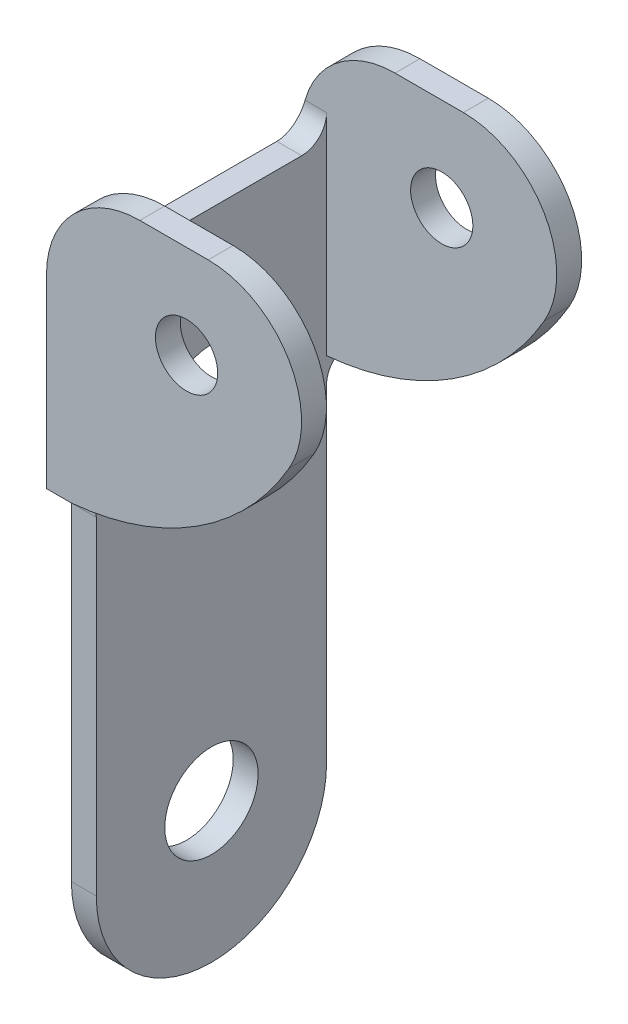
ISO-10303-21;
HEADER;
FILE_DESCRIPTION(('STEP AP214'),'2;1');
FILE_NAME('part.step','',(''),(''),'','','');
FILE_SCHEMA(('AUTOMOTIVE_DESIGN { 1 0 10303 214 1 1 1 1 }'));
ENDSEC;
DATA;
#1=APPLICATION_CONTEXT('core data for automotive mechanical design processes');
#2=APPLICATION_PROTOCOL_DEFINITION('international standard','automotive_design',2000,#1);
#3=PRODUCT_CONTEXT('',#1,'mechanical');
#4=PRODUCT('Part','Part','',(#3));
#5=PRODUCT_RELATED_PRODUCT_CATEGORY('part','',(#4));
#6=PRODUCT_DEFINITION_FORMATION('','',#4);
#7=PRODUCT_DEFINITION_CONTEXT('part definition',#1,'design');
#8=PRODUCT_DEFINITION('design','',#6,#7);
#9=PRODUCT_DEFINITION_SHAPE('','',#8);
#10=(LENGTH_UNIT() NAMED_UNIT(*) SI_UNIT(.MILLI.,.METRE.));
#11=(NAMED_UNIT(*) PLANE_ANGLE_UNIT() SI_UNIT($,.RADIAN.));
#12=(NAMED_UNIT(*) SI_UNIT($,.STERADIAN.) SOLID_ANGLE_UNIT());
#13=UNCERTAINTY_MEASURE_WITH_UNIT(LENGTH_MEASURE(1.E-05),#10,'distance_accuracy_value','');
#14=(GEOMETRIC_REPRESENTATION_CONTEXT(3) GLOBAL_UNCERTAINTY_ASSIGNED_CONTEXT((#13)) GLOBAL_UNIT_ASSIGNED_CONTEXT((#10,
#11,#12)) REPRESENTATION_CONTEXT('',''));
#15=CARTESIAN_POINT('',(0.,0.,0.));
#16=DIRECTION('',(0.,0.,1.));
#17=DIRECTION('',(1.,0.,0.));
#18=AXIS2_PLACEMENT_3D('',#15,#16,#17);
#19=CARTESIAN_POINT('',(3.,-3.,9.));
#20=DIRECTION('',(0.,0.,-1.));
#21=DIRECTION('',(-1.,0.,0.));
#22=AXIS2_PLACEMENT_3D('',#19,#20,#21);
#23=CYLINDRICAL_SURFACE('',#22,3.);
#24=DIRECTION('',(0.,0.,-1.));
#25=VECTOR('',#24,1.);
#26=CARTESIAN_POINT('',(0.,-3.00000000000002,9.));
#27=LINE('',#26,#25);
#28=CARTESIAN_POINT('',(0.,-3.00000000000002,1.6));
#29=VERTEX_POINT('',#28);
#30=CARTESIAN_POINT('',(0.,-3.00000000000002,0.));
#31=VERTEX_POINT('',#30);
#32=EDGE_CURVE('E78',#29,#31,#27,.T.);
#33=ORIENTED_EDGE('',*,*,#32,.F.);
#34=CARTESIAN_POINT('',(0.,-3.00000000000002,1.6));
#35=CARTESIAN_POINT('',(2.87806993574752E-05,-3.00003818556474,1.55502517826722));
#36=CARTESIAN_POINT('',(4.85053215636375E-07,-2.99620964469084,1.51006143487486));
#37=CARTESIAN_POINT('',(4.24255470232043E-05,-2.98109971439457,1.42143305589088));
#38=CARTESIAN_POINT('',(0.000112596742496792,-2.96982323990331,1.37776758340801));
#39=CARTESIAN_POINT('',(0.0005637499066889,-2.94008964810371,1.29292808477208));
#40=CARTESIAN_POINT('',(0.000944893279920676,-2.92162880448089,1.25175536436086));
#41=CARTESIAN_POINT('',(0.00239939670118121,-2.8780706836421,1.17310507178846));
#42=CARTESIAN_POINT('',(0.0034726413585196,-2.85297451311344,1.13562688485627));
#43=CARTESIAN_POINT('',(0.00674815071768452,-2.7969611115115,1.06554332434435));
#44=CARTESIAN_POINT('',(0.00894705438300764,-2.76606138184054,1.03292381573542));
#45=CARTESIAN_POINT('',(0.0149175529878104,-2.69933056592727,0.973367678057924));
#46=CARTESIAN_POINT('',(0.018688993534979,-2.66349996403131,0.946430491487552));
#47=CARTESIAN_POINT('',(0.0281189652833072,-2.58849951955176,0.899281077478162));
#48=CARTESIAN_POINT('',(0.0337540493018954,-2.54937545790675,0.878991234047217));
#49=CARTESIAN_POINT('',(0.0471494277231632,-2.46863861495519,0.845184045103718));
#50=CARTESIAN_POINT('',(0.0549095023971071,-2.42702609130865,0.831665999780932));
#51=CARTESIAN_POINT('',(0.0701426227375723,-2.35431519180404,0.814396635076594));
#52=CARTESIAN_POINT('',(0.0771016539994946,-2.32349134586151,0.808978242167804));
#53=CARTESIAN_POINT('',(0.0920829449349645,-2.26173244566136,0.801779125758912));
#54=CARTESIAN_POINT('',(0.100103383660825,-2.23079766821784,0.799992256032336));
#55=CARTESIAN_POINT('',(0.108633541039802,-2.20000000000002,0.8));
#56=B_SPLINE_CURVE_WITH_KNOTS('',3,(#34,#35,#36,#37,#38,#39,#40,#41,#42,#43,#44,#45,#46,#47,#48,
#49,#50,#51,#52,#53,#54,#55),.UNSPECIFIED.,.F.,.F.,(4,2,2,2,2,2,2,2,2,2,4),(0.,
0.134746053656328,0.269403276396195,0.404130435039601,0.538835137082711,0.673139958361328,
0.807431596641673,0.940094151455307,1.0727429938437,1.16871102751224,1.26451650291084),.UNSPECIFIED.);
#57=CARTESIAN_POINT('',(0.108633541039802,-2.20000000000002,0.8));
#58=VERTEX_POINT('',#57);
#59=EDGE_CURVE('E249',#29,#58,#56,.T.);
#60=ORIENTED_EDGE('',*,*,#59,.T.);
#61=CARTESIAN_POINT('',(3.,-3.,0.8));
#62=DIRECTION('',(0.,0.,1.));
#63=DIRECTION('',(0.,-1.,0.));
#64=AXIS2_PLACEMENT_3D('',#61,#62,#63);
#65=CIRCLE('',#64,3.);
#66=CARTESIAN_POINT('',(3.00000000000002,0.,0.8));
#67=VERTEX_POINT('',#66);
#68=EDGE_CURVE('E197',#67,#58,#65,.T.);
#69=ORIENTED_EDGE('',*,*,#68,.F.);
#70=DIRECTION('',(0.,0.,-1.));
#71=VECTOR('',#70,1.);
#72=CARTESIAN_POINT('',(3.00000000000002,0.,9.));
#73=LINE('',#72,#71);
#74=CARTESIAN_POINT('',(3.00000000000002,0.,0.));
#75=VERTEX_POINT('',#74);
#76=EDGE_CURVE('E184',#67,#75,#73,.T.);
#77=ORIENTED_EDGE('',*,*,#76,.T.);
#78=CARTESIAN_POINT('',(3.,-3.,0.));
#79=DIRECTION('',(0.,0.,1.));
#80=DIRECTION('',(1.,0.,0.));
#81=AXIS2_PLACEMENT_3D('',#78,#79,#80);
#82=CIRCLE('',#81,3.);
#83=EDGE_CURVE('E179',#75,#31,#82,.T.);
#84=ORIENTED_EDGE('',*,*,#83,.T.);
#85=EDGE_LOOP('',(#33,#60,#69,#77,#84));
#86=FACE_BOUND('',#85,.T.);
#87=ADVANCED_FACE('F34',(#86),#23,.T.);
#88=CARTESIAN_POINT('',(0.,0.,9.));
#89=DIRECTION('',(0.,0.,-1.));
#90=DIRECTION('',(-1.,0.,0.));
#91=AXIS2_PLACEMENT_3D('',#88,#89,#90);
#92=CYLINDRICAL_SURFACE('',#91,9.);
#93=CARTESIAN_POINT('',(0.,0.,8.2));
#94=DIRECTION('',(0.,0.,-1.));
#95=DIRECTION('',(-1.,0.,0.));
#96=AXIS2_PLACEMENT_3D('',#93,#94,#95);
#97=CIRCLE('',#96,9.);
#98=CARTESIAN_POINT('',(7.79422863405995,-4.5,8.2));
#99=VERTEX_POINT('',#98);
#100=CARTESIAN_POINT('',(0.800000000000003,-8.96437393240599,8.2));
#101=VERTEX_POINT('',#100);
#102=EDGE_CURVE('E148',#99,#101,#97,.T.);
#103=ORIENTED_EDGE('',*,*,#102,.F.);
#104=DIRECTION('',(0.,0.,-1.));
#105=VECTOR('',#104,1.);
#106=CARTESIAN_POINT('',(7.79422863405995,-4.5,9.));
#107=LINE('',#106,#105);
#108=CARTESIAN_POINT('',(7.79422863405995,-4.5,9.));
#109=VERTEX_POINT('',#108);
#110=EDGE_CURVE('E191',#109,#99,#107,.T.);
#111=ORIENTED_EDGE('',*,*,#110,.F.);
#112=CARTESIAN_POINT('',(0.,0.,9.));
#113=DIRECTION('',(0.,0.,1.));
#114=DIRECTION('',(1.,0.,0.));
#115=AXIS2_PLACEMENT_3D('',#112,#113,#114);
#116=CIRCLE('',#115,9.);
#117=CARTESIAN_POINT('',(0.800000000000003,-8.96437393240599,8.99999520579808));
#118=VERTEX_POINT('',#117);
#119=EDGE_CURVE('E156',#118,#109,#116,.T.);
#120=ORIENTED_EDGE('',*,*,#119,.F.);
#121=DIRECTION('',(0.,0.,-1.));
#122=VECTOR('',#121,1.);
#123=CARTESIAN_POINT('',(0.800000000000003,-8.96437393240599,8.2));
#124=LINE('',#123,#122);
#125=EDGE_CURVE('E11',#101,#118,#124,.F.);
#126=ORIENTED_EDGE('',*,*,#125,.F.);
#127=EDGE_LOOP('',(#103,#111,#120,#126));
#128=FACE_BOUND('',#127,.T.);
#129=ADVANCED_FACE('F288',(#128),#92,.T.);
#130=CARTESIAN_POINT('',(0.,0.,0.8));
#131=DIRECTION('',(0.,0.,1.));
#132=DIRECTION('',(0.,-1.,0.));
#133=AXIS2_PLACEMENT_3D('',#130,#131,#132);
#134=CIRCLE('',#133,9.);
#135=CARTESIAN_POINT('',(0.800000000000003,-8.96437393240599,0.8));
#136=VERTEX_POINT('',#135);
#137=CARTESIAN_POINT('',(7.79422863405995,-4.5,0.8));
#138=VERTEX_POINT('',#137);
#139=EDGE_CURVE('E141',#136,#138,#134,.T.);
#140=ORIENTED_EDGE('',*,*,#139,.F.);
#141=DIRECTION('',(0.,0.,-1.));
#142=VECTOR('',#141,1.);
#143=CARTESIAN_POINT('',(0.800000000000003,-8.96437393240599,0.8));
#144=LINE('',#143,#142);
#145=CARTESIAN_POINT('',(0.800000000000003,-8.96437393240599,0.));
#146=VERTEX_POINT('',#145);
#147=EDGE_CURVE('E43',#136,#146,#144,.T.);
#148=ORIENTED_EDGE('',*,*,#147,.T.);
#149=CARTESIAN_POINT('',(0.,0.,0.));
#150=DIRECTION('',(0.,0.,1.));
#151=DIRECTION('',(1.,0.,0.));
#152=AXIS2_PLACEMENT_3D('',#149,#150,#151);
#153=CIRCLE('',#152,9.);
#154=CARTESIAN_POINT('',(7.79422863405995,-4.5,0.));
#155=VERTEX_POINT('',#154);
#156=EDGE_CURVE('E59',#146,#155,#153,.T.);
#157=ORIENTED_EDGE('',*,*,#156,.T.);
#158=EDGE_CURVE('E190',#138,#155,#107,.T.);
#159=ORIENTED_EDGE('',*,*,#158,.F.);
#160=EDGE_LOOP('',(#140,#148,#157,#159));
#161=FACE_BOUND('',#160,.T.);
#162=ADVANCED_FACE('F291',(#161),#92,.T.);
#163=CARTESIAN_POINT('',(5.19615242270663,-3.,9.));
#164=DIRECTION('',(0.,0.,-1.));
#165=DIRECTION('',(-1.,0.,0.));
#166=AXIS2_PLACEMENT_3D('',#163,#164,#165);
#167=CYLINDRICAL_SURFACE('',#166,3.);
#168=CARTESIAN_POINT('',(5.19615242270663,-3.,8.2));
#169=DIRECTION('',(0.,0.,-1.));
#170=DIRECTION('',(-1.,0.,0.));
#171=AXIS2_PLACEMENT_3D('',#168,#169,#170);
#172=CIRCLE('',#171,3.);
#173=CARTESIAN_POINT('',(5.19615242270663,0.,8.2));
#174=VERTEX_POINT('',#173);
#175=EDGE_CURVE('E138',#174,#99,#172,.T.);
#176=ORIENTED_EDGE('',*,*,#175,.F.);
#177=DIRECTION('',(0.,0.,-1.));
#178=VECTOR('',#177,1.);
#179=CARTESIAN_POINT('',(5.19615242270663,0.,9.));
#180=LINE('',#179,#178);
#181=CARTESIAN_POINT('',(5.19615242270663,0.,9.));
#182=VERTEX_POINT('',#181);
#183=EDGE_CURVE('E187',#182,#174,#180,.T.);
#184=ORIENTED_EDGE('',*,*,#183,.F.);
#185=CARTESIAN_POINT('',(5.19615242270663,-3.,9.));
#186=DIRECTION('',(0.,0.,1.));
#187=DIRECTION('',(-1.,0.,0.));
#188=AXIS2_PLACEMENT_3D('',#185,#186,#187);
#189=CIRCLE('',#188,3.);
#190=EDGE_CURVE('E159',#109,#182,#189,.T.);
#191=ORIENTED_EDGE('',*,*,#190,.F.);
#192=ORIENTED_EDGE('',*,*,#110,.T.);
#193=EDGE_LOOP('',(#176,#184,#191,#192));
#194=FACE_BOUND('',#193,.T.);
#195=ADVANCED_FACE('F293',(#194),#167,.T.);
#196=CARTESIAN_POINT('',(5.19615242270663,-3.,0.8));
#197=DIRECTION('',(0.,0.,1.));
#198=DIRECTION('',(0.,-1.,0.));
#199=AXIS2_PLACEMENT_3D('',#196,#197,#198);
#200=CIRCLE('',#199,3.);
#201=CARTESIAN_POINT('',(5.19615242270663,0.,0.8));
#202=VERTEX_POINT('',#201);
#203=EDGE_CURVE('E383',#138,#202,#200,.T.);
#204=ORIENTED_EDGE('',*,*,#203,.F.);
#205=ORIENTED_EDGE('',*,*,#158,.T.);
#206=CARTESIAN_POINT('',(5.19615242270663,-3.,0.));
#207=DIRECTION('',(0.,0.,1.));
#208=DIRECTION('',(-1.,0.,0.));
#209=AXIS2_PLACEMENT_3D('',#206,#207,#208);
#210=CIRCLE('',#209,3.);
#211=CARTESIAN_POINT('',(5.19615242270663,0.,0.));
#212=VERTEX_POINT('',#211);
#213=EDGE_CURVE('E173',#155,#212,#210,.T.);
#214=ORIENTED_EDGE('',*,*,#213,.T.);
#215=EDGE_CURVE('E186',#202,#212,#180,.T.);
#216=ORIENTED_EDGE('',*,*,#215,.F.);
#217=EDGE_LOOP('',(#204,#205,#214,#216));
#218=FACE_BOUND('',#217,.T.);
#219=ADVANCED_FACE('F295',(#218),#167,.T.);
#220=CARTESIAN_POINT('',(3.00000000000002,0.,9.));
#221=DIRECTION('',(0.,-1.,0.));
#222=DIRECTION('',(0.,0.,-1.));
#223=AXIS2_PLACEMENT_3D('',#220,#221,#222);
#224=PLANE('',#223);
#225=DIRECTION('',(1.,0.,0.));
#226=VECTOR('',#225,1.);
#227=CARTESIAN_POINT('',(3.00000000000002,0.,8.2));
#228=LINE('',#227,#226);
#229=CARTESIAN_POINT('',(3.00000000000002,0.,8.2));
#230=VERTEX_POINT('',#229);
#231=EDGE_CURVE('E135',#230,#174,#228,.T.);
#232=ORIENTED_EDGE('',*,*,#231,.F.);
#233=CARTESIAN_POINT('',(3.00000000000002,0.,9.));
#234=VERTEX_POINT('',#233);
#235=EDGE_CURVE('E134',#234,#230,#73,.T.);
#236=ORIENTED_EDGE('',*,*,#235,.F.);
#237=DIRECTION('',(-1.,0.,0.));
#238=VECTOR('',#237,1.);
#239=CARTESIAN_POINT('',(3.00000000000002,0.,9.));
#240=LINE('',#239,#238);
#241=EDGE_CURVE('E163',#182,#234,#240,.T.);
#242=ORIENTED_EDGE('',*,*,#241,.F.);
#243=ORIENTED_EDGE('',*,*,#183,.T.);
#244=EDGE_LOOP('',(#232,#236,#242,#243));
#245=FACE_BOUND('',#244,.T.);
#246=ADVANCED_FACE('F297',(#245),#224,.F.);
#247=DIRECTION('',(-1.,0.,0.));
#248=VECTOR('',#247,1.);
#249=CARTESIAN_POINT('',(3.00000000000002,0.,0.8));
#250=LINE('',#249,#248);
#251=EDGE_CURVE('E381',#202,#67,#250,.T.);
#252=ORIENTED_EDGE('',*,*,#251,.F.);
#253=ORIENTED_EDGE('',*,*,#215,.T.);
#254=DIRECTION('',(-1.,0.,0.));
#255=VECTOR('',#254,1.);
#256=CARTESIAN_POINT('',(3.00000000000002,0.,0.));
#257=LINE('',#256,#255);
#258=EDGE_CURVE('E176',#212,#75,#257,.T.);
#259=ORIENTED_EDGE('',*,*,#258,.T.);
#260=ORIENTED_EDGE('',*,*,#76,.F.);
#261=EDGE_LOOP('',(#252,#253,#259,#260));
#262=FACE_BOUND('',#261,.T.);
#263=ADVANCED_FACE('F299',(#262),#224,.F.);
#264=CARTESIAN_POINT('',(3.,-3.,8.2));
#265=DIRECTION('',(0.,0.,-1.));
#266=DIRECTION('',(-1.,0.,0.));
#267=AXIS2_PLACEMENT_3D('',#264,#265,#266);
#268=CIRCLE('',#267,3.);
#269=CARTESIAN_POINT('',(0.108633541039802,-2.20000000000002,8.2));
#270=VERTEX_POINT('',#269);
#271=EDGE_CURVE('E121',#270,#230,#268,.T.);
#272=ORIENTED_EDGE('',*,*,#271,.F.);
#273=CARTESIAN_POINT('',(0.108633541039802,-2.20000000000002,8.2));
#274=CARTESIAN_POINT('',(0.102650368204865,-2.22161986461892,8.19999985524568));
#275=CARTESIAN_POINT('',(0.0969146327022358,-2.24329935575236,8.19912286596118));
#276=CARTESIAN_POINT('',(0.0859602487654984,-2.28664780333388,8.19559144580189));
#277=CARTESIAN_POINT('',(0.0807416901442402,-2.30831675730418,8.19293670682216));
#278=CARTESIAN_POINT('',(0.0659095579337459,-2.373051741425,8.18227890805753));
#279=CARTESIAN_POINT('',(0.0571055632026915,-2.41589658990173,8.17158237064074));
#280=CARTESIAN_POINT('',(0.0417140562180433,-2.49963573606118,8.14308803340637));
#281=CARTESIAN_POINT('',(0.0351300579802407,-2.54052685421392,8.12527907180362));
#282=CARTESIAN_POINT('',(0.0240317983461395,-2.61897200226587,8.08296859446588));
#283=CARTESIAN_POINT('',(0.0195164101535142,-2.65652783992232,8.05847073388814));
#284=CARTESIAN_POINT('',(0.0122917653090871,-2.72647407393607,8.00395069320643));
#285=CARTESIAN_POINT('',(0.00955121616063715,-2.75894584825805,7.97403684449184));
#286=CARTESIAN_POINT('',(0.00534132182408222,-2.81857495704096,7.90921970553808));
#287=CARTESIAN_POINT('',(0.00387239826363584,-2.84573052652202,7.87431476488936));
#288=CARTESIAN_POINT('',(0.00177038042093891,-2.89411265647501,7.80022532097805));
#289=CARTESIAN_POINT('',(0.00114354177540068,-2.91529392860677,7.76101110396053));
#290=CARTESIAN_POINT('',(0.00034962224644296,-2.95085638811022,7.6796161278033));
#291=CARTESIAN_POINT('',(0.000182351398395637,-2.96524038313368,7.63743660178536));
#292=CARTESIAN_POINT('',(3.19262642979337E-05,-2.98398426233863,7.5626105884577));
#293=CARTESIAN_POINT('',(1.19954503756616E-05,-2.98998360708334,7.53036444183133));
#294=CARTESIAN_POINT('',(4.90280423282133E-08,-2.99799306928873,7.465416227604));
#295=CARTESIAN_POINT('',(8.00314978917241E-06,-3.00000750875555,7.43271469273839));
#296=CARTESIAN_POINT('',(0.,-3.00000000000002,7.4));
#297=B_SPLINE_CURVE_WITH_KNOTS('',3,(#273,#274,#275,#276,#277,#278,#279,#280,#281,#282,#283,
#284,#285,#286,#287,#288,#289,#290,#291,#292,#293,#294,#295,#296),.UNSPECIFIED.,.F.,.F.,(4,2,2,
2,2,2,2,2,2,2,2,4),(0.,0.0672606518643437,0.134532963809343,0.268921793097781,0.403522357637836,
0.53804951622872,0.670135115051074,0.802264492195835,0.935370095480015,1.06842067061939,
1.16658422269628,1.26464124862761),.UNSPECIFIED.);
#298=CARTESIAN_POINT('',(0.,-3.00000000000002,7.4));
#299=VERTEX_POINT('',#298);
#300=EDGE_CURVE('E106',#270,#299,#297,.T.);
#301=ORIENTED_EDGE('',*,*,#300,.T.);
#302=CARTESIAN_POINT('',(0.,-3.00000000000002,9.));
#303=VERTEX_POINT('',#302);
#304=EDGE_CURVE('E50',#303,#299,#27,.T.);
#305=ORIENTED_EDGE('',*,*,#304,.F.);
#306=CARTESIAN_POINT('',(3.,-3.,9.));
#307=DIRECTION('',(0.,0.,1.));
#308=DIRECTION('',(1.,0.,0.));
#309=AXIS2_PLACEMENT_3D('',#306,#307,#308);
#310=CIRCLE('',#309,3.);
#311=EDGE_CURVE('E166',#234,#303,#310,.T.);
#312=ORIENTED_EDGE('',*,*,#311,.F.);
#313=ORIENTED_EDGE('',*,*,#235,.T.);
#314=EDGE_LOOP('',(#272,#301,#305,#312,#313));
#315=FACE_BOUND('',#314,.T.);
#316=ADVANCED_FACE('F131',(#315),#23,.T.);
#317=CARTESIAN_POINT('',(4.5,-3.,9.));
#318=DIRECTION('',(0.,0.,-1.));
#319=DIRECTION('',(-1.,0.,0.));
#320=AXIS2_PLACEMENT_3D('',#317,#318,#319);
#321=CYLINDRICAL_SURFACE('',#320,1.);
#322=CARTESIAN_POINT('',(4.5,-3.,9.));
#323=DIRECTION('',(0.,0.,1.));
#324=DIRECTION('',(1.,0.,0.));
#325=AXIS2_PLACEMENT_3D('',#322,#323,#324);
#326=CIRCLE('',#325,1.);
#327=CARTESIAN_POINT('',(5.5,-3.,9.));
#328=VERTEX_POINT('',#327);
#329=EDGE_CURVE('E151',#328,#328,#326,.T.);
#330=ORIENTED_EDGE('',*,*,#329,.T.);
#331=EDGE_LOOP('',(#330));
#332=FACE_BOUND('',#331,.T.);
#333=CARTESIAN_POINT('',(4.5,-3.,8.2));
#334=DIRECTION('',(0.,0.,-1.));
#335=DIRECTION('',(-1.,0.,0.));
#336=AXIS2_PLACEMENT_3D('',#333,#334,#335);
#337=CIRCLE('',#336,1.);
#338=CARTESIAN_POINT('',(3.5,-3.,8.2));
#339=VERTEX_POINT('',#338);
#340=EDGE_CURVE('E136',#339,#339,#337,.T.);
#341=ORIENTED_EDGE('',*,*,#340,.T.);
#342=EDGE_LOOP('',(#341));
#343=FACE_BOUND('',#342,.T.);
#344=ADVANCED_FACE('F311',(#332,#343),#321,.F.);
#345=CARTESIAN_POINT('',(4.5,-3.,0.));
#346=DIRECTION('',(0.,0.,1.));
#347=DIRECTION('',(1.,0.,0.));
#348=AXIS2_PLACEMENT_3D('',#345,#346,#347);
#349=CIRCLE('',#348,1.);
#350=CARTESIAN_POINT('',(5.5,-3.,0.));
#351=VERTEX_POINT('',#350);
#352=EDGE_CURVE('E150',#351,#351,#349,.T.);
#353=ORIENTED_EDGE('',*,*,#352,.F.);
#354=EDGE_LOOP('',(#353));
#355=FACE_BOUND('',#354,.T.);
#356=CARTESIAN_POINT('',(4.5,-3.,0.8));
#357=DIRECTION('',(0.,0.,1.));
#358=DIRECTION('',(0.,-1.,0.));
#359=AXIS2_PLACEMENT_3D('',#356,#357,#358);
#360=CIRCLE('',#359,1.);
#361=CARTESIAN_POINT('',(4.5,-4.,0.8));
#362=VERTEX_POINT('',#361);
#363=EDGE_CURVE('E195',#362,#362,#360,.T.);
#364=ORIENTED_EDGE('',*,*,#363,.T.);
#365=EDGE_LOOP('',(#364));
#366=FACE_BOUND('',#365,.T.);
#367=ADVANCED_FACE('F315',(#355,#366),#321,.F.);
#368=CARTESIAN_POINT('',(0.,0.,9.));
#369=DIRECTION('',(0.,0.,1.));
#370=DIRECTION('',(1.,0.,0.));
#371=AXIS2_PLACEMENT_3D('',#368,#369,#370);
#372=PLANE('',#371);
#373=DIRECTION('',(1.,0.,0.));
#374=VECTOR('',#373,1.);
#375=CARTESIAN_POINT('',(-8.2,-8.96437393240599,9.));
#376=LINE('',#375,#374);
#377=CARTESIAN_POINT('',(0.,-8.96437393240599,9.));
#378=VERTEX_POINT('',#377);
#379=EDGE_CURVE('E370',#378,#118,#376,.T.);
#380=ORIENTED_EDGE('',*,*,#379,.T.);
#381=ORIENTED_EDGE('',*,*,#119,.T.);
#382=ORIENTED_EDGE('',*,*,#190,.T.);
#383=ORIENTED_EDGE('',*,*,#241,.T.);
#384=ORIENTED_EDGE('',*,*,#311,.T.);
#385=DIRECTION('',(0.,-1.,0.));
#386=VECTOR('',#385,1.);
#387=CARTESIAN_POINT('',(0.,-3.00000000000002,9.));
#388=LINE('',#387,#386);
#389=EDGE_CURVE('E169',#303,#378,#388,.T.);
#390=ORIENTED_EDGE('',*,*,#389,.T.);
#391=EDGE_LOOP('',(#380,#381,#382,#383,#384,#390));
#392=FACE_BOUND('',#391,.T.);
#393=ORIENTED_EDGE('',*,*,#329,.F.);
#394=EDGE_LOOP('',(#393));
#395=FACE_BOUND('',#394,.T.);
#396=ADVANCED_FACE('F321',(#392,#395),#372,.T.);
#397=CARTESIAN_POINT('',(0.,0.,0.));
#398=DIRECTION('',(0.,0.,1.));
#399=DIRECTION('',(1.,0.,0.));
#400=AXIS2_PLACEMENT_3D('',#397,#398,#399);
#401=PLANE('',#400);
#402=ORIENTED_EDGE('',*,*,#156,.F.);
#403=DIRECTION('',(1.,0.,0.));
#404=VECTOR('',#403,1.);
#405=CARTESIAN_POINT('',(-8.2,-8.96437393240599,0.));
#406=LINE('',#405,#404);
#407=CARTESIAN_POINT('',(0.,-8.96437393240599,0.));
#408=VERTEX_POINT('',#407);
#409=EDGE_CURVE('E352',#408,#146,#406,.T.);
#410=ORIENTED_EDGE('',*,*,#409,.F.);
#411=DIRECTION('',(0.,-1.,0.));
#412=VECTOR('',#411,1.);
#413=CARTESIAN_POINT('',(0.,-3.00000000000002,0.));
#414=LINE('',#413,#412);
#415=EDGE_CURVE('E160',#31,#408,#414,.T.);
#416=ORIENTED_EDGE('',*,*,#415,.F.);
#417=ORIENTED_EDGE('',*,*,#83,.F.);
#418=ORIENTED_EDGE('',*,*,#258,.F.);
#419=ORIENTED_EDGE('',*,*,#213,.F.);
#420=EDGE_LOOP('',(#402,#410,#416,#417,#418,#419));
#421=FACE_BOUND('',#420,.T.);
#422=ORIENTED_EDGE('',*,*,#352,.T.);
#423=EDGE_LOOP('',(#422));
#424=FACE_BOUND('',#423,.T.);
#425=ADVANCED_FACE('F286',(#421,#424),#401,.F.);
#426=CARTESIAN_POINT('',(0.8,-24.,9.));
#427=DIRECTION('',(-1.,0.,0.));
#428=DIRECTION('',(0.,-1.,0.));
#429=AXIS2_PLACEMENT_3D('',#426,#427,#428);
#430=PLANE('',#429);
#431=CARTESIAN_POINT('',(0.800000000000003,-8.30000000000002,4.5));
#432=DIRECTION('',(1.,0.,0.));
#433=DIRECTION('',(0.,1.,0.));
#434=AXIS2_PLACEMENT_3D('',#431,#432,#433);
#435=CIRCLE('',#434,1.5);
#436=CARTESIAN_POINT('',(0.800000000000003,-6.80000000000002,4.5));
#437=VERTEX_POINT('',#436);
#438=EDGE_CURVE('E227',#437,#437,#435,.T.);
#439=ORIENTED_EDGE('',*,*,#438,.F.);
#440=EDGE_LOOP('',(#439));
#441=FACE_BOUND('',#440,.T.);
#442=CARTESIAN_POINT('',(0.800000000000001,-19.5,4.5));
#443=DIRECTION('',(1.,0.,0.));
#444=DIRECTION('',(0.,1.,0.));
#445=AXIS2_PLACEMENT_3D('',#442,#443,#444);
#446=CIRCLE('',#445,1.5);
#447=CARTESIAN_POINT('',(0.800000000000001,-18.,4.5));
#448=VERTEX_POINT('',#447);
#449=EDGE_CURVE('E438',#448,#448,#446,.T.);
#450=ORIENTED_EDGE('',*,*,#449,.F.);
#451=EDGE_LOOP('',(#450));
#452=FACE_BOUND('',#451,.T.);
#453=DIRECTION('',(0.,1.,0.));
#454=VECTOR('',#453,1.);
#455=CARTESIAN_POINT('',(0.800000000000003,-8.96437393240599,0.8));
#456=LINE('',#455,#454);
#457=CARTESIAN_POINT('',(0.800000000000004,-2.20000000000002,0.8));
#458=VERTEX_POINT('',#457);
#459=EDGE_CURVE('E198',#136,#458,#456,.T.);
#460=ORIENTED_EDGE('',*,*,#459,.T.);
#461=CARTESIAN_POINT('',(0.800000000000004,-2.20000000000002,1.6));
#462=DIRECTION('',(-1.,0.,0.));
#463=DIRECTION('',(0.,-1.,0.));
#464=AXIS2_PLACEMENT_3D('',#461,#462,#463);
#465=CIRCLE('',#464,0.8);
#466=CARTESIAN_POINT('',(0.800000000000004,-3.00000000000002,1.6));
#467=VERTEX_POINT('',#466);
#468=EDGE_CURVE('E114',#458,#467,#465,.T.);
#469=ORIENTED_EDGE('',*,*,#468,.T.);
#470=DIRECTION('',(0.,0.,1.));
#471=VECTOR('',#470,1.);
#472=CARTESIAN_POINT('',(0.800000000000004,-3.00000000000002,9.));
#473=LINE('',#472,#471);
#474=CARTESIAN_POINT('',(0.800000000000004,-3.00000000000002,7.4));
#475=VERTEX_POINT('',#474);
#476=EDGE_CURVE('E222',#467,#475,#473,.T.);
#477=ORIENTED_EDGE('',*,*,#476,.T.);
#478=CARTESIAN_POINT('',(0.800000000000004,-2.20000000000002,7.4));
#479=DIRECTION('',(-1.,0.,0.));
#480=DIRECTION('',(0.,-1.,0.));
#481=AXIS2_PLACEMENT_3D('',#478,#479,#480);
#482=CIRCLE('',#481,0.8);
#483=CARTESIAN_POINT('',(0.800000000000004,-2.20000000000002,8.2));
#484=VERTEX_POINT('',#483);
#485=EDGE_CURVE('E113',#475,#484,#482,.T.);
#486=ORIENTED_EDGE('',*,*,#485,.T.);
#487=DIRECTION('',(0.,-1.,0.));
#488=VECTOR('',#487,1.);
#489=CARTESIAN_POINT('',(0.800000000000003,-8.96437393240599,8.2));
#490=LINE('',#489,#488);
#491=EDGE_CURVE('E125',#484,#101,#490,.T.);
#492=ORIENTED_EDGE('',*,*,#491,.T.);
#493=ORIENTED_EDGE('',*,*,#125,.T.);
#494=CARTESIAN_POINT('',(0.800000000000004,-9.76437393240599,9.));
#495=DIRECTION('',(-1.,0.,0.));
#496=DIRECTION('',(0.,-1.,0.));
#497=AXIS2_PLACEMENT_3D('',#494,#495,#496);
#498=CIRCLE('',#497,0.8);
#499=CARTESIAN_POINT('',(0.800000000000003,-9.76437393240599,8.2));
#500=VERTEX_POINT('',#499);
#501=EDGE_CURVE('E88',#118,#500,#498,.T.);
#502=ORIENTED_EDGE('',*,*,#501,.T.);
#503=DIRECTION('',(0.,1.,0.));
#504=VECTOR('',#503,1.);
#505=CARTESIAN_POINT('',(0.800000000000003,-8.96437393240599,8.2));
#506=LINE('',#505,#504);
#507=CARTESIAN_POINT('',(0.800000000000001,-20.3,8.2));
#508=VERTEX_POINT('',#507);
#509=EDGE_CURVE('E367',#508,#500,#506,.T.);
#510=ORIENTED_EDGE('',*,*,#509,.F.);
#511=CARTESIAN_POINT('',(0.800000000000001,-20.3,4.5));
#512=DIRECTION('',(-1.,0.,0.));
#513=DIRECTION('',(0.,-1.,0.));
#514=AXIS2_PLACEMENT_3D('',#511,#512,#513);
#515=CIRCLE('',#514,3.7);
#516=CARTESIAN_POINT('',(0.8,-24.,4.5));
#517=VERTEX_POINT('',#516);
#518=EDGE_CURVE('E194',#508,#517,#515,.F.);
#519=ORIENTED_EDGE('',*,*,#518,.T.);
#520=CARTESIAN_POINT('',(0.800000000000001,-20.3,4.5));
#521=DIRECTION('',(-1.,0.,0.));
#522=DIRECTION('',(0.,-1.,0.));
#523=AXIS2_PLACEMENT_3D('',#520,#521,#522);
#524=CIRCLE('',#523,3.7);
#525=CARTESIAN_POINT('',(0.800000000000001,-20.3,0.8));
#526=VERTEX_POINT('',#525);
#527=EDGE_CURVE('E202',#517,#526,#524,.F.);
#528=ORIENTED_EDGE('',*,*,#527,.T.);
#529=DIRECTION('',(0.,-1.,0.));
#530=VECTOR('',#529,1.);
#531=CARTESIAN_POINT('',(0.800000000000003,-8.96437393240599,0.8));
#532=LINE('',#531,#530);
#533=CARTESIAN_POINT('',(0.800000000000003,-9.76437393240599,0.8));
#534=VERTEX_POINT('',#533);
#535=EDGE_CURVE('E221',#534,#526,#532,.T.);
#536=ORIENTED_EDGE('',*,*,#535,.F.);
#537=CARTESIAN_POINT('',(0.800000000000004,-9.76437393240599,0.));
#538=DIRECTION('',(-1.,0.,0.));
#539=DIRECTION('',(0.,-1.,0.));
#540=AXIS2_PLACEMENT_3D('',#537,#538,#539);
#541=CIRCLE('',#540,0.8);
#542=EDGE_CURVE('E127',#534,#146,#541,.T.);
#543=ORIENTED_EDGE('',*,*,#542,.T.);
#544=ORIENTED_EDGE('',*,*,#147,.F.);
#545=EDGE_LOOP('',(#460,#469,#477,#486,#492,#493,#502,#510,#519,#528,#536,#543,#544));
#546=FACE_BOUND('',#545,.T.);
#547=ADVANCED_FACE('F282',(#441,#452,#546),#430,.F.);
#548=CARTESIAN_POINT('',(0.,-3.00000000000002,9.));
#549=DIRECTION('',(1.,0.,0.));
#550=DIRECTION('',(0.,0.,-1.));
#551=AXIS2_PLACEMENT_3D('',#548,#549,#550);
#552=PLANE('',#551);
#553=CARTESIAN_POINT('',(0.,-8.30000000000002,4.5));
#554=DIRECTION('',(1.,0.,0.));
#555=DIRECTION('',(0.,0.,-1.));
#556=AXIS2_PLACEMENT_3D('',#553,#554,#555);
#557=CIRCLE('',#556,1.5);
#558=CARTESIAN_POINT('',(0.,-8.30000000000002,3.));
#559=VERTEX_POINT('',#558);
#560=EDGE_CURVE('E226',#559,#559,#557,.T.);
#561=ORIENTED_EDGE('',*,*,#560,.T.);
#562=EDGE_LOOP('',(#561));
#563=FACE_BOUND('',#562,.T.);
#564=CARTESIAN_POINT('',(0.,-19.5,4.5));
#565=DIRECTION('',(1.,0.,0.));
#566=DIRECTION('',(0.,0.,-1.));
#567=AXIS2_PLACEMENT_3D('',#564,#565,#566);
#568=CIRCLE('',#567,1.5);
#569=CARTESIAN_POINT('',(0.,-19.5,3.));
#570=VERTEX_POINT('',#569);
#571=EDGE_CURVE('E223',#570,#570,#568,.T.);
#572=ORIENTED_EDGE('',*,*,#571,.T.);
#573=EDGE_LOOP('',(#572));
#574=FACE_BOUND('',#573,.T.);
#575=ORIENTED_EDGE('',*,*,#415,.T.);
#576=CARTESIAN_POINT('',(0.,-9.76437393240599,0.));
#577=DIRECTION('',(1.,0.,0.));
#578=DIRECTION('',(0.,0.,-1.));
#579=AXIS2_PLACEMENT_3D('',#576,#577,#578);
#580=CIRCLE('',#579,0.8);
#581=CARTESIAN_POINT('',(0.,-9.76437393240599,0.8));
#582=VERTEX_POINT('',#581);
#583=EDGE_CURVE('E242',#408,#582,#580,.T.);
#584=ORIENTED_EDGE('',*,*,#583,.T.);
#585=DIRECTION('',(0.,-1.,0.));
#586=VECTOR('',#585,1.);
#587=CARTESIAN_POINT('',(0.,-3.00000000000002,0.8));
#588=LINE('',#587,#586);
#589=CARTESIAN_POINT('',(0.,-20.3,0.8));
#590=VERTEX_POINT('',#589);
#591=EDGE_CURVE('E359',#582,#590,#588,.T.);
#592=ORIENTED_EDGE('',*,*,#591,.T.);
#593=CARTESIAN_POINT('',(0.,-20.3,4.5));
#594=DIRECTION('',(1.,0.,0.));
#595=DIRECTION('',(0.,0.,-1.));
#596=AXIS2_PLACEMENT_3D('',#593,#594,#595);
#597=CIRCLE('',#596,3.7);
#598=CARTESIAN_POINT('',(0.,-24.,4.5));
#599=VERTEX_POINT('',#598);
#600=EDGE_CURVE('E211',#590,#599,#597,.F.);
#601=ORIENTED_EDGE('',*,*,#600,.T.);
#602=CARTESIAN_POINT('',(0.,-20.3,4.5));
#603=DIRECTION('',(1.,0.,0.));
#604=DIRECTION('',(0.,0.,-1.));
#605=AXIS2_PLACEMENT_3D('',#602,#603,#604);
#606=CIRCLE('',#605,3.7);
#607=CARTESIAN_POINT('',(0.,-20.3,8.2));
#608=VERTEX_POINT('',#607);
#609=EDGE_CURVE('E208',#599,#608,#606,.F.);
#610=ORIENTED_EDGE('',*,*,#609,.T.);
#611=DIRECTION('',(0.,1.,0.));
#612=VECTOR('',#611,1.);
#613=CARTESIAN_POINT('',(0.,-3.00000000000002,8.2));
#614=LINE('',#613,#612);
#615=CARTESIAN_POINT('',(0.,-9.76437393240599,8.2));
#616=VERTEX_POINT('',#615);
#617=EDGE_CURVE('E374',#608,#616,#614,.T.);
#618=ORIENTED_EDGE('',*,*,#617,.T.);
#619=CARTESIAN_POINT('',(0.,-9.76437393240599,9.));
#620=DIRECTION('',(1.,0.,0.));
#621=DIRECTION('',(0.,0.,-1.));
#622=AXIS2_PLACEMENT_3D('',#619,#620,#621);
#623=CIRCLE('',#622,0.8);
#624=EDGE_CURVE('E246',#616,#378,#623,.T.);
#625=ORIENTED_EDGE('',*,*,#624,.T.);
#626=ORIENTED_EDGE('',*,*,#389,.F.);
#627=ORIENTED_EDGE('',*,*,#304,.T.);
#628=DIRECTION('',(0.,0.,1.));
#629=VECTOR('',#628,1.);
#630=CARTESIAN_POINT('',(0.,-3.00000000000002,0.8));
#631=LINE('',#630,#629);
#632=EDGE_CURVE('E230',#29,#299,#631,.T.);
#633=ORIENTED_EDGE('',*,*,#632,.F.);
#634=ORIENTED_EDGE('',*,*,#32,.T.);
#635=EDGE_LOOP('',(#575,#584,#592,#601,#610,#618,#625,#626,#627,#633,#634));
#636=FACE_BOUND('',#635,.T.);
#637=ADVANCED_FACE('F285',(#563,#574,#636),#552,.F.);
#638=CARTESIAN_POINT('',(9.8,-8.96437393240599,8.2));
#639=DIRECTION('',(0.,0.,-1.));
#640=DIRECTION('',(-1.,0.,0.));
#641=AXIS2_PLACEMENT_3D('',#638,#639,#640);
#642=PLANE('',#641);
#643=ORIENTED_EDGE('',*,*,#340,.F.);
#644=EDGE_LOOP('',(#643));
#645=FACE_BOUND('',#644,.T.);
#646=ORIENTED_EDGE('',*,*,#491,.F.);
#647=DIRECTION('',(-1.,0.,0.));
#648=VECTOR('',#647,1.);
#649=CARTESIAN_POINT('',(9.8,-2.20000000000002,8.2));
#650=LINE('',#649,#648);
#651=EDGE_CURVE('E109',#484,#270,#650,.T.);
#652=ORIENTED_EDGE('',*,*,#651,.T.);
#653=ORIENTED_EDGE('',*,*,#271,.T.);
#654=ORIENTED_EDGE('',*,*,#231,.T.);
#655=ORIENTED_EDGE('',*,*,#175,.T.);
#656=ORIENTED_EDGE('',*,*,#102,.T.);
#657=EDGE_LOOP('',(#646,#652,#653,#654,#655,#656));
#658=FACE_BOUND('',#657,.T.);
#659=ADVANCED_FACE('F118',(#645,#658),#642,.T.);
#660=CARTESIAN_POINT('',(9.8,-8.96437393240599,0.8));
#661=DIRECTION('',(0.,0.,1.));
#662=DIRECTION('',(0.,-1.,0.));
#663=AXIS2_PLACEMENT_3D('',#660,#661,#662);
#664=PLANE('',#663);
#665=ORIENTED_EDGE('',*,*,#363,.F.);
#666=EDGE_LOOP('',(#665));
#667=FACE_BOUND('',#666,.T.);
#668=ORIENTED_EDGE('',*,*,#68,.T.);
#669=DIRECTION('',(-1.,0.,0.));
#670=VECTOR('',#669,1.);
#671=CARTESIAN_POINT('',(9.8,-2.20000000000002,0.8));
#672=LINE('',#671,#670);
#673=EDGE_CURVE('E128',#58,#458,#672,.F.);
#674=ORIENTED_EDGE('',*,*,#673,.T.);
#675=ORIENTED_EDGE('',*,*,#459,.F.);
#676=ORIENTED_EDGE('',*,*,#139,.T.);
#677=ORIENTED_EDGE('',*,*,#203,.T.);
#678=ORIENTED_EDGE('',*,*,#251,.T.);
#679=EDGE_LOOP('',(#668,#674,#675,#676,#677,#678));
#680=FACE_BOUND('',#679,.T.);
#681=ADVANCED_FACE('F336',(#667,#680),#664,.T.);
#682=CARTESIAN_POINT('',(-8.2,-8.96437393240599,0.8));
#683=DIRECTION('',(0.,0.,1.));
#684=DIRECTION('',(1.,0.,0.));
#685=AXIS2_PLACEMENT_3D('',#682,#683,#684);
#686=PLANE('',#685);
#687=ORIENTED_EDGE('',*,*,#591,.F.);
#688=DIRECTION('',(1.,0.,0.));
#689=VECTOR('',#688,1.);
#690=CARTESIAN_POINT('',(0.800000000000002,-9.76437393240599,0.8));
#691=LINE('',#690,#689);
#692=EDGE_CURVE('E217',#582,#534,#691,.T.);
#693=ORIENTED_EDGE('',*,*,#692,.T.);
#694=ORIENTED_EDGE('',*,*,#535,.T.);
#695=DIRECTION('',(1.,0.,0.));
#696=VECTOR('',#695,1.);
#697=CARTESIAN_POINT('',(-8.2,-20.3,0.8));
#698=LINE('',#697,#696);
#699=EDGE_CURVE('E205',#526,#590,#698,.F.);
#700=ORIENTED_EDGE('',*,*,#699,.T.);
#701=EDGE_LOOP('',(#687,#693,#694,#700));
#702=FACE_BOUND('',#701,.T.);
#703=ADVANCED_FACE('F357',(#702),#686,.F.);
#704=CARTESIAN_POINT('',(-8.2,-8.96437393240599,8.2));
#705=DIRECTION('',(0.,0.,-1.));
#706=DIRECTION('',(-1.,0.,0.));
#707=AXIS2_PLACEMENT_3D('',#704,#705,#706);
#708=PLANE('',#707);
#709=ORIENTED_EDGE('',*,*,#509,.T.);
#710=DIRECTION('',(1.,0.,0.));
#711=VECTOR('',#710,1.);
#712=CARTESIAN_POINT('',(0.,-9.76437393240599,8.2));
#713=LINE('',#712,#711);
#714=EDGE_CURVE('E233',#500,#616,#713,.F.);
#715=ORIENTED_EDGE('',*,*,#714,.T.);
#716=ORIENTED_EDGE('',*,*,#617,.F.);
#717=DIRECTION('',(-1.,0.,0.));
#718=VECTOR('',#717,1.);
#719=CARTESIAN_POINT('',(-8.2,-20.3,8.2));
#720=LINE('',#719,#718);
#721=EDGE_CURVE('E214',#608,#508,#720,.F.);
#722=ORIENTED_EDGE('',*,*,#721,.T.);
#723=EDGE_LOOP('',(#709,#715,#716,#722));
#724=FACE_BOUND('',#723,.T.);
#725=ADVANCED_FACE('F276',(#724),#708,.F.);
#726=CARTESIAN_POINT('',(0.,-20.3,4.5));
#727=DIRECTION('',(-1.,0.,0.));
#728=DIRECTION('',(0.,0.,1.));
#729=AXIS2_PLACEMENT_3D('',#726,#727,#728);
#730=CYLINDRICAL_SURFACE('',#729,3.7);
#731=ORIENTED_EDGE('',*,*,#721,.F.);
#732=ORIENTED_EDGE('',*,*,#609,.F.);
#733=DIRECTION('',(-1.,0.,0.));
#734=VECTOR('',#733,1.);
#735=CARTESIAN_POINT('',(0.,-24.,4.5));
#736=LINE('',#735,#734);
#737=EDGE_CURVE('E218',#517,#599,#736,.T.);
#738=ORIENTED_EDGE('',*,*,#737,.F.);
#739=ORIENTED_EDGE('',*,*,#518,.F.);
#740=EDGE_LOOP('',(#731,#732,#738,#739));
#741=FACE_BOUND('',#740,.T.);
#742=ADVANCED_FACE('F272',(#741),#730,.T.);
#743=CARTESIAN_POINT('',(0.,-20.3,4.5));
#744=DIRECTION('',(1.,0.,0.));
#745=DIRECTION('',(0.,0.,-1.));
#746=AXIS2_PLACEMENT_3D('',#743,#744,#745);
#747=CYLINDRICAL_SURFACE('',#746,3.7);
#748=ORIENTED_EDGE('',*,*,#600,.F.);
#749=ORIENTED_EDGE('',*,*,#699,.F.);
#750=ORIENTED_EDGE('',*,*,#527,.F.);
#751=ORIENTED_EDGE('',*,*,#737,.T.);
#752=EDGE_LOOP('',(#748,#749,#750,#751));
#753=FACE_BOUND('',#752,.T.);
#754=ADVANCED_FACE('F275',(#753),#747,.T.);
#755=CARTESIAN_POINT('',(9.,-3.00000000000002,0.8));
#756=DIRECTION('',(0.,-1.,0.));
#757=DIRECTION('',(0.,0.,-1.));
#758=AXIS2_PLACEMENT_3D('',#755,#756,#757);
#759=PLANE('',#758);
#760=ORIENTED_EDGE('',*,*,#476,.F.);
#761=DIRECTION('',(-1.,0.,0.));
#762=VECTOR('',#761,1.);
#763=CARTESIAN_POINT('',(9.,-3.00000000000002,1.6));
#764=LINE('',#763,#762);
#765=EDGE_CURVE('E236',#467,#29,#764,.T.);
#766=ORIENTED_EDGE('',*,*,#765,.T.);
#767=ORIENTED_EDGE('',*,*,#632,.T.);
#768=DIRECTION('',(-1.,0.,0.));
#769=VECTOR('',#768,1.);
#770=CARTESIAN_POINT('',(9.,-3.00000000000002,7.4));
#771=LINE('',#770,#769);
#772=EDGE_CURVE('E110',#299,#475,#771,.F.);
#773=ORIENTED_EDGE('',*,*,#772,.T.);
#774=EDGE_LOOP('',(#760,#766,#767,#773));
#775=FACE_BOUND('',#774,.T.);
#776=ADVANCED_FACE('F280',(#775),#759,.F.);
#777=CARTESIAN_POINT('',(-8.2,-19.5,4.5));
#778=DIRECTION('',(1.,0.,0.));
#779=DIRECTION('',(0.,1.,0.));
#780=AXIS2_PLACEMENT_3D('',#777,#778,#779);
#781=CYLINDRICAL_SURFACE('',#780,1.5);
#782=ORIENTED_EDGE('',*,*,#449,.T.);
#783=EDGE_LOOP('',(#782));
#784=FACE_BOUND('',#783,.T.);
#785=ORIENTED_EDGE('',*,*,#571,.F.);
#786=EDGE_LOOP('',(#785));
#787=FACE_BOUND('',#786,.T.);
#788=ADVANCED_FACE('F448',(#784,#787),#781,.F.);
#789=CARTESIAN_POINT('',(-8.2,-8.30000000000002,4.5));
#790=DIRECTION('',(1.,0.,0.));
#791=DIRECTION('',(0.,1.,0.));
#792=AXIS2_PLACEMENT_3D('',#789,#790,#791);
#793=CYLINDRICAL_SURFACE('',#792,1.5);
#794=ORIENTED_EDGE('',*,*,#438,.T.);
#795=EDGE_LOOP('',(#794));
#796=FACE_BOUND('',#795,.T.);
#797=ORIENTED_EDGE('',*,*,#560,.F.);
#798=EDGE_LOOP('',(#797));
#799=FACE_BOUND('',#798,.T.);
#800=ADVANCED_FACE('F270',(#796,#799),#793,.F.);
#801=CARTESIAN_POINT('',(-8.2,-9.76437393240599,0.));
#802=DIRECTION('',(-1.,0.,0.));
#803=DIRECTION('',(0.,-1.,0.));
#804=AXIS2_PLACEMENT_3D('',#801,#802,#803);
#805=CYLINDRICAL_SURFACE('',#804,0.8);
#806=ORIENTED_EDGE('',*,*,#583,.F.);
#807=ORIENTED_EDGE('',*,*,#409,.T.);
#808=ORIENTED_EDGE('',*,*,#542,.F.);
#809=ORIENTED_EDGE('',*,*,#692,.F.);
#810=EDGE_LOOP('',(#806,#807,#808,#809));
#811=FACE_BOUND('',#810,.T.);
#812=ADVANCED_FACE('F266',(#811),#805,.F.);
#813=CARTESIAN_POINT('',(-8.2,-9.76437393240599,9.));
#814=DIRECTION('',(-1.,0.,0.));
#815=DIRECTION('',(0.,-1.,0.));
#816=AXIS2_PLACEMENT_3D('',#813,#814,#815);
#817=CYLINDRICAL_SURFACE('',#816,0.8);
#818=ORIENTED_EDGE('',*,*,#624,.F.);
#819=ORIENTED_EDGE('',*,*,#714,.F.);
#820=ORIENTED_EDGE('',*,*,#501,.F.);
#821=ORIENTED_EDGE('',*,*,#379,.F.);
#822=EDGE_LOOP('',(#818,#819,#820,#821));
#823=FACE_BOUND('',#822,.T.);
#824=ADVANCED_FACE('F262',(#823),#817,.F.);
#825=CARTESIAN_POINT('',(9.,-2.20000000000002,1.6));
#826=DIRECTION('',(-1.,0.,0.));
#827=DIRECTION('',(0.,0.,1.));
#828=AXIS2_PLACEMENT_3D('',#825,#826,#827);
#829=CYLINDRICAL_SURFACE('',#828,0.8);
#830=ORIENTED_EDGE('',*,*,#468,.F.);
#831=ORIENTED_EDGE('',*,*,#673,.F.);
#832=ORIENTED_EDGE('',*,*,#59,.F.);
#833=ORIENTED_EDGE('',*,*,#765,.F.);
#834=EDGE_LOOP('',(#830,#831,#832,#833));
#835=FACE_BOUND('',#834,.T.);
#836=ADVANCED_FACE('F258',(#835),#829,.F.);
#837=CARTESIAN_POINT('',(9.8,-2.20000000000002,7.4));
#838=DIRECTION('',(-1.,0.,0.));
#839=DIRECTION('',(0.,0.,1.));
#840=AXIS2_PLACEMENT_3D('',#837,#838,#839);
#841=CYLINDRICAL_SURFACE('',#840,0.8);
#842=ORIENTED_EDGE('',*,*,#485,.F.);
#843=ORIENTED_EDGE('',*,*,#772,.F.);
#844=ORIENTED_EDGE('',*,*,#300,.F.);
#845=ORIENTED_EDGE('',*,*,#651,.F.);
#846=EDGE_LOOP('',(#842,#843,#844,#845));
#847=FACE_BOUND('',#846,.T.);
#848=ADVANCED_FACE('F36',(#847),#841,.F.);
#849=CLOSED_SHELL('',(#87,#129,#162,#195,#219,#246,#263,#316,#344,#367,#396,#425,#547,#637,#659,
#681,#703,#725,#742,#754,#776,#788,#800,#812,#824,#836,#848));
#850=MANIFOLD_SOLID_BREP('B2',#849);
#851=ADVANCED_BREP_SHAPE_REPRESENTATION('',(#18,#850),#14);
#852=SHAPE_DEFINITION_REPRESENTATION(#9,#851);
ENDSEC;
END-ISO-10303-21;
